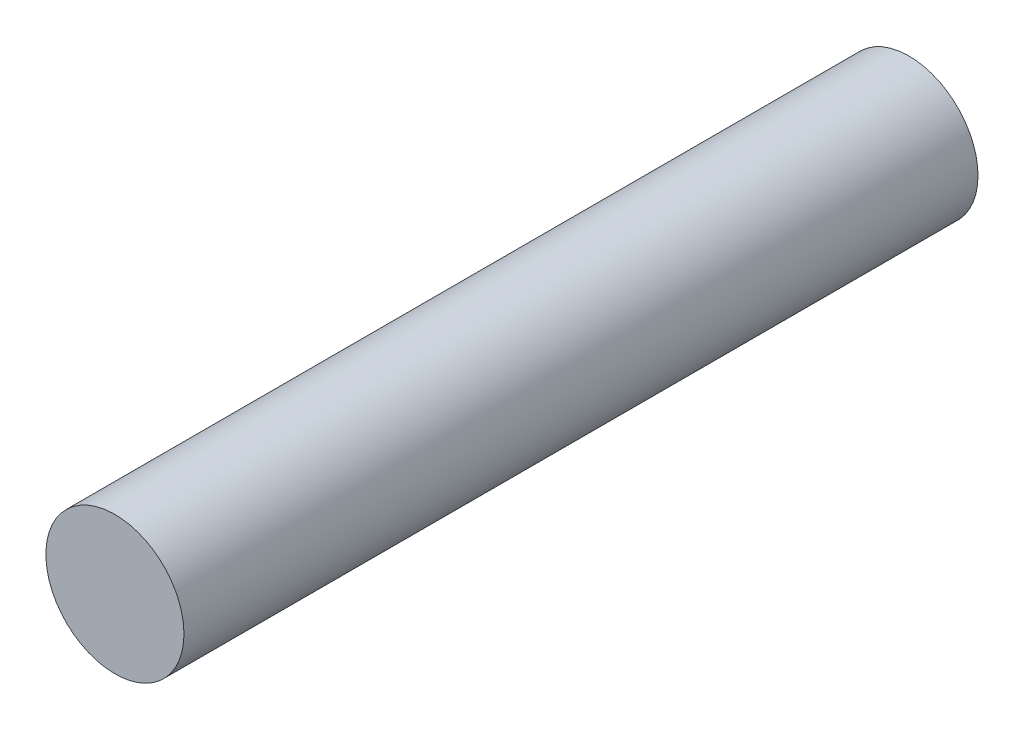
ISO-10303-21;
HEADER;
FILE_DESCRIPTION(('STEP AP214'),'2;1');
FILE_NAME('part.step','',(''),(''),'','','');
FILE_SCHEMA(('AUTOMOTIVE_DESIGN { 1 0 10303 214 1 1 1 1 }'));
ENDSEC;
DATA;
#1=APPLICATION_CONTEXT('core data for automotive mechanical design processes');
#2=APPLICATION_PROTOCOL_DEFINITION('international standard','automotive_design',2000,#1);
#3=PRODUCT_CONTEXT('',#1,'mechanical');
#4=PRODUCT('Part','Part','',(#3));
#5=PRODUCT_RELATED_PRODUCT_CATEGORY('part','',(#4));
#6=PRODUCT_DEFINITION_FORMATION('','',#4);
#7=PRODUCT_DEFINITION_CONTEXT('part definition',#1,'design');
#8=PRODUCT_DEFINITION('design','',#6,#7);
#9=PRODUCT_DEFINITION_SHAPE('','',#8);
#10=(LENGTH_UNIT() NAMED_UNIT(*) SI_UNIT(.MILLI.,.METRE.));
#11=(NAMED_UNIT(*) PLANE_ANGLE_UNIT() SI_UNIT($,.RADIAN.));
#12=(NAMED_UNIT(*) SI_UNIT($,.STERADIAN.) SOLID_ANGLE_UNIT());
#13=UNCERTAINTY_MEASURE_WITH_UNIT(LENGTH_MEASURE(1.E-05),#10,'distance_accuracy_value','');
#14=(GEOMETRIC_REPRESENTATION_CONTEXT(3) GLOBAL_UNCERTAINTY_ASSIGNED_CONTEXT((#13)) GLOBAL_UNIT_ASSIGNED_CONTEXT((#10,
#11,#12)) REPRESENTATION_CONTEXT('',''));
#15=CARTESIAN_POINT('',(0.,0.,0.));
#16=DIRECTION('',(0.,0.,1.));
#17=DIRECTION('',(1.,0.,0.));
#18=AXIS2_PLACEMENT_3D('',#15,#16,#17);
#19=CARTESIAN_POINT('',(0.,0.,23.));
#20=DIRECTION('',(0.,0.,-1.));
#21=DIRECTION('',(-1.,0.,0.));
#22=AXIS2_PLACEMENT_3D('',#19,#20,#21);
#23=CYLINDRICAL_SURFACE('',#22,2.);
#24=CARTESIAN_POINT('',(0.,0.,23.));
#25=DIRECTION('',(0.,0.,1.));
#26=DIRECTION('',(1.,0.,0.));
#27=AXIS2_PLACEMENT_3D('',#24,#25,#26);
#28=CIRCLE('',#27,2.);
#29=CARTESIAN_POINT('',(2.,0.,23.));
#30=VERTEX_POINT('',#29);
#31=EDGE_CURVE('E10',#30,#30,#28,.T.);
#32=ORIENTED_EDGE('',*,*,#31,.F.);
#33=EDGE_LOOP('',(#32));
#34=FACE_BOUND('',#33,.T.);
#35=CARTESIAN_POINT('',(0.,0.,0.));
#36=DIRECTION('',(0.,0.,1.));
#37=DIRECTION('',(1.,0.,0.));
#38=AXIS2_PLACEMENT_3D('',#35,#36,#37);
#39=CIRCLE('',#38,2.);
#40=CARTESIAN_POINT('',(2.,0.,0.));
#41=VERTEX_POINT('',#40);
#42=EDGE_CURVE('E42',#41,#41,#39,.T.);
#43=ORIENTED_EDGE('',*,*,#42,.T.);
#44=EDGE_LOOP('',(#43));
#45=FACE_BOUND('',#44,.T.);
#46=ADVANCED_FACE('F39',(#34,#45),#23,.T.);
#47=CARTESIAN_POINT('',(0.,0.,23.));
#48=DIRECTION('',(0.,0.,1.));
#49=DIRECTION('',(1.,0.,0.));
#50=AXIS2_PLACEMENT_3D('',#47,#48,#49);
#51=PLANE('',#50);
#52=ORIENTED_EDGE('',*,*,#31,.T.);
#53=EDGE_LOOP('',(#52));
#54=FACE_BOUND('',#53,.T.);
#55=ADVANCED_FACE('F56',(#54),#51,.T.);
#56=CARTESIAN_POINT('',(0.,0.,0.));
#57=DIRECTION('',(0.,0.,1.));
#58=DIRECTION('',(1.,0.,0.));
#59=AXIS2_PLACEMENT_3D('',#56,#57,#58);
#60=PLANE('',#59);
#61=ORIENTED_EDGE('',*,*,#42,.F.);
#62=EDGE_LOOP('',(#61));
#63=FACE_BOUND('',#62,.T.);
#64=ADVANCED_FACE('F54',(#63),#60,.F.);
#65=CLOSED_SHELL('',(#46,#55,#64));
#66=MANIFOLD_SOLID_BREP('B2',#65);
#67=ADVANCED_BREP_SHAPE_REPRESENTATION('',(#18,#66),#14);
#68=SHAPE_DEFINITION_REPRESENTATION(#9,#67);
ENDSEC;
END-ISO-10303-21;
